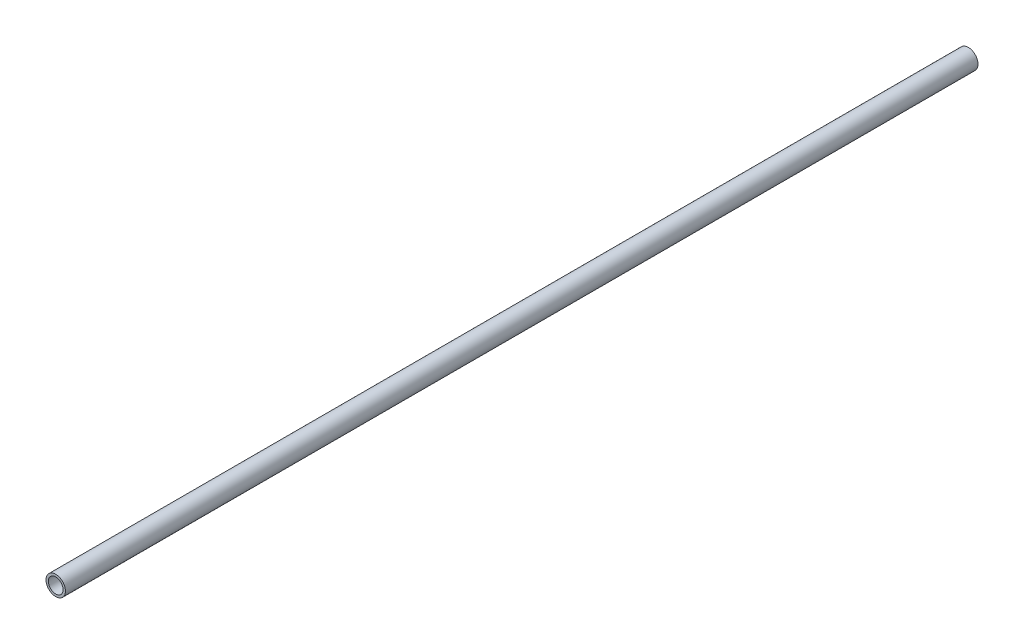
ISO-10303-21;
HEADER;
FILE_DESCRIPTION(('STEP AP214'),'2;1');
FILE_NAME('part.step','',(''),(''),'','','');
FILE_SCHEMA(('AUTOMOTIVE_DESIGN { 1 0 10303 214 1 1 1 1 }'));
ENDSEC;
DATA;
#1=APPLICATION_CONTEXT('core data for automotive mechanical design processes');
#2=APPLICATION_PROTOCOL_DEFINITION('international standard','automotive_design',2000,#1);
#3=PRODUCT_CONTEXT('',#1,'mechanical');
#4=PRODUCT('Part','Part','',(#3));
#5=PRODUCT_RELATED_PRODUCT_CATEGORY('part','',(#4));
#6=PRODUCT_DEFINITION_FORMATION('','',#4);
#7=PRODUCT_DEFINITION_CONTEXT('part definition',#1,'design');
#8=PRODUCT_DEFINITION('design','',#6,#7);
#9=PRODUCT_DEFINITION_SHAPE('','',#8);
#10=(LENGTH_UNIT() NAMED_UNIT(*) SI_UNIT(.MILLI.,.METRE.));
#11=(NAMED_UNIT(*) PLANE_ANGLE_UNIT() SI_UNIT($,.RADIAN.));
#12=(NAMED_UNIT(*) SI_UNIT($,.STERADIAN.) SOLID_ANGLE_UNIT());
#13=UNCERTAINTY_MEASURE_WITH_UNIT(LENGTH_MEASURE(1.E-05),#10,'distance_accuracy_value','');
#14=(GEOMETRIC_REPRESENTATION_CONTEXT(3) GLOBAL_UNCERTAINTY_ASSIGNED_CONTEXT((#13)) GLOBAL_UNIT_ASSIGNED_CONTEXT((#10,
#11,#12)) REPRESENTATION_CONTEXT('',''));
#15=CARTESIAN_POINT('',(0.,0.,0.));
#16=DIRECTION('',(0.,0.,1.));
#17=DIRECTION('',(1.,0.,0.));
#18=AXIS2_PLACEMENT_3D('',#15,#16,#17);
#19=CARTESIAN_POINT('',(0.,0.,1568.196));
#20=DIRECTION('',(0.,0.,1.));
#21=DIRECTION('',(1.,0.,0.));
#22=AXIS2_PLACEMENT_3D('',#19,#20,#21);
#23=PLANE('',#22);
#24=CARTESIAN_POINT('',(0.,0.,1568.196));
#25=DIRECTION('',(0.,0.,1.));
#26=DIRECTION('',(1.,0.,0.));
#27=AXIS2_PLACEMENT_3D('',#24,#25,#26);
#28=CIRCLE('',#27,16.7005);
#29=CARTESIAN_POINT('',(-16.7005,0.,1568.196));
#30=VERTEX_POINT('',#29);
#31=EDGE_CURVE('E10',#30,#30,#28,.T.);
#32=ORIENTED_EDGE('',*,*,#31,.T.);
#33=EDGE_LOOP('',(#32));
#34=FACE_BOUND('',#33,.T.);
#35=CARTESIAN_POINT('',(0.,0.,1568.196));
#36=DIRECTION('',(0.,0.,1.));
#37=DIRECTION('',(1.,0.,0.));
#38=AXIS2_PLACEMENT_3D('',#35,#36,#37);
#39=CIRCLE('',#38,12.7);
#40=CARTESIAN_POINT('',(-12.7,0.,1568.196));
#41=VERTEX_POINT('',#40);
#42=EDGE_CURVE('E44',#41,#41,#39,.T.);
#43=ORIENTED_EDGE('',*,*,#42,.F.);
#44=EDGE_LOOP('',(#43));
#45=FACE_BOUND('',#44,.T.);
#46=ADVANCED_FACE('F33',(#34,#45),#23,.T.);
#47=CARTESIAN_POINT('',(0.,0.,0.));
#48=DIRECTION('',(0.,0.,1.));
#49=DIRECTION('',(1.,0.,0.));
#50=AXIS2_PLACEMENT_3D('',#47,#48,#49);
#51=PLANE('',#50);
#52=CARTESIAN_POINT('',(0.,0.,0.));
#53=DIRECTION('',(0.,0.,1.));
#54=DIRECTION('',(1.,0.,0.));
#55=AXIS2_PLACEMENT_3D('',#52,#53,#54);
#56=CIRCLE('',#55,16.7005);
#57=CARTESIAN_POINT('',(-16.7005,0.,-2.22044604925031E-13));
#58=VERTEX_POINT('',#57);
#59=EDGE_CURVE('E37',#58,#58,#56,.T.);
#60=ORIENTED_EDGE('',*,*,#59,.F.);
#61=EDGE_LOOP('',(#60));
#62=FACE_BOUND('',#61,.T.);
#63=CARTESIAN_POINT('',(0.,0.,0.));
#64=DIRECTION('',(0.,0.,1.));
#65=DIRECTION('',(1.,0.,0.));
#66=AXIS2_PLACEMENT_3D('',#63,#64,#65);
#67=CIRCLE('',#66,12.7);
#68=CARTESIAN_POINT('',(-12.7,0.,-2.22044604925031E-13));
#69=VERTEX_POINT('',#68);
#70=EDGE_CURVE('E46',#69,#69,#67,.T.);
#71=ORIENTED_EDGE('',*,*,#70,.T.);
#72=EDGE_LOOP('',(#71));
#73=FACE_BOUND('',#72,.T.);
#74=ADVANCED_FACE('F56',(#62,#73),#51,.F.);
#75=CARTESIAN_POINT('',(0.,0.,1568.196));
#76=DIRECTION('',(0.,0.,-1.));
#77=DIRECTION('',(-1.,0.,0.));
#78=AXIS2_PLACEMENT_3D('',#75,#76,#77);
#79=CYLINDRICAL_SURFACE('',#78,16.7005);
#80=CARTESIAN_POINT('',(-16.7005,0.,1568.196));
#81=CARTESIAN_POINT('',(-16.7005,0.,1551.860625));
#82=CARTESIAN_POINT('',(-16.7005,0.,1535.52525));
#83=CARTESIAN_POINT('',(-16.7005,0.,1502.8545));
#84=CARTESIAN_POINT('',(-16.7005,0.,1486.519125));
#85=CARTESIAN_POINT('',(-16.7005,0.,1453.848375));
#86=CARTESIAN_POINT('',(-16.7005,0.,1437.513));
#87=CARTESIAN_POINT('',(-16.7005,0.,1404.84225));
#88=CARTESIAN_POINT('',(-16.7005,0.,1388.506875));
#89=CARTESIAN_POINT('',(-16.7005,0.,1355.836125));
#90=CARTESIAN_POINT('',(-16.7005,0.,1339.50075));
#91=CARTESIAN_POINT('',(-16.7005,0.,1306.83));
#92=CARTESIAN_POINT('',(-16.7005,0.,1290.494625));
#93=CARTESIAN_POINT('',(-16.7005,0.,1257.823875));
#94=CARTESIAN_POINT('',(-16.7005,0.,1241.4885));
#95=CARTESIAN_POINT('',(-16.7005,0.,1208.81775));
#96=CARTESIAN_POINT('',(-16.7005,0.,1192.482375));
#97=CARTESIAN_POINT('',(-16.7005,0.,1159.811625));
#98=CARTESIAN_POINT('',(-16.7005,0.,1143.47625));
#99=CARTESIAN_POINT('',(-16.7005,0.,1110.8055));
#100=CARTESIAN_POINT('',(-16.7005,0.,1094.470125));
#101=CARTESIAN_POINT('',(-16.7005,0.,1061.799375));
#102=CARTESIAN_POINT('',(-16.7005,0.,1045.464));
#103=CARTESIAN_POINT('',(-16.7005,0.,1012.79325));
#104=CARTESIAN_POINT('',(-16.7005,0.,996.457875));
#105=CARTESIAN_POINT('',(-16.7005,0.,963.787125));
#106=CARTESIAN_POINT('',(-16.7005,0.,947.45175));
#107=CARTESIAN_POINT('',(-16.7005,0.,914.781));
#108=CARTESIAN_POINT('',(-16.7005,0.,898.445625));
#109=CARTESIAN_POINT('',(-16.7005,0.,865.774875));
#110=CARTESIAN_POINT('',(-16.7005,0.,849.4395));
#111=CARTESIAN_POINT('',(-16.7005,0.,816.76875));
#112=CARTESIAN_POINT('',(-16.7005,0.,800.433375));
#113=CARTESIAN_POINT('',(-16.7005,0.,767.762625));
#114=CARTESIAN_POINT('',(-16.7005,0.,751.42725));
#115=CARTESIAN_POINT('',(-16.7005,0.,718.7565));
#116=CARTESIAN_POINT('',(-16.7005,0.,702.421125));
#117=CARTESIAN_POINT('',(-16.7005,0.,669.750375));
#118=CARTESIAN_POINT('',(-16.7005,0.,653.415));
#119=CARTESIAN_POINT('',(-16.7005,0.,620.74425));
#120=CARTESIAN_POINT('',(-16.7005,0.,604.408875));
#121=CARTESIAN_POINT('',(-16.7005,0.,571.738125));
#122=CARTESIAN_POINT('',(-16.7005,0.,555.40275));
#123=CARTESIAN_POINT('',(-16.7005,0.,522.732));
#124=CARTESIAN_POINT('',(-16.7005,0.,506.396625));
#125=CARTESIAN_POINT('',(-16.7005,0.,473.725875));
#126=CARTESIAN_POINT('',(-16.7005,0.,457.3905));
#127=CARTESIAN_POINT('',(-16.7005,0.,424.71975));
#128=CARTESIAN_POINT('',(-16.7005,0.,408.384375));
#129=CARTESIAN_POINT('',(-16.7005,0.,375.713625));
#130=CARTESIAN_POINT('',(-16.7005,0.,359.37825));
#131=CARTESIAN_POINT('',(-16.7005,0.,326.7075));
#132=CARTESIAN_POINT('',(-16.7005,0.,310.372125));
#133=CARTESIAN_POINT('',(-16.7005,0.,277.701375));
#134=CARTESIAN_POINT('',(-16.7005,0.,261.366));
#135=CARTESIAN_POINT('',(-16.7005,0.,228.69525));
#136=CARTESIAN_POINT('',(-16.7005,0.,212.359875));
#137=CARTESIAN_POINT('',(-16.7005,0.,179.689125));
#138=CARTESIAN_POINT('',(-16.7005,0.,163.35375));
#139=CARTESIAN_POINT('',(-16.7005,0.,130.683));
#140=CARTESIAN_POINT('',(-16.7005,0.,114.347625));
#141=CARTESIAN_POINT('',(-16.7005,0.,81.6768749999998));
#142=CARTESIAN_POINT('',(-16.7005,0.,65.3414999999998));
#143=CARTESIAN_POINT('',(-16.7005,0.,32.6707499999998));
#144=CARTESIAN_POINT('',(-16.7005,0.,16.3353749999998));
#145=CARTESIAN_POINT('',(-16.7005,0.,-2.22044604925031E-13));
#146=B_SPLINE_CURVE_WITH_KNOTS('',3,(#80,#81,#82,#83,#84,#85,#86,#87,#88,#89,#90,#91,#92,#93,
#94,#95,#96,#97,#98,#99,#100,#101,#102,#103,#104,#105,#106,#107,#108,#109,#110,#111,#112,#113,
#114,#115,#116,#117,#118,#119,#120,#121,#122,#123,#124,#125,#126,#127,#128,#129,#130,#131,#132,
#133,#134,#135,#136,#137,#138,#139,#140,#141,#142,#143,#144,#145),.UNSPECIFIED.,.F.,.F.,(4,2,2,
2,2,2,2,2,2,2,2,2,2,2,2,2,2,2,2,2,2,2,2,2,2,2,2,2,2,2,2,2,4),(0.,49.006125,98.01225,147.018375,
196.0245,245.030625,294.03675,343.042875,392.049,441.055125,490.06125,539.067375,588.0735,
637.079625,686.08575,735.091875,784.098,833.104125,882.11025,931.116375,980.1225,1029.128625,
1078.13475,1127.140875,1176.147,1225.153125,1274.15925,1323.165375,1372.1715,1421.177625,
1470.18375,1519.189875,1568.196),.UNSPECIFIED.);
#147=EDGE_CURVE('BSEAM35',#30,#58,#146,.T.);
#148=ORIENTED_EDGE('',*,*,#31,.F.);
#149=ORIENTED_EDGE('',*,*,#59,.T.);
#150=ORIENTED_EDGE('',*,*,#147,.T.);
#151=ORIENTED_EDGE('',*,*,#147,.F.);
#152=EDGE_LOOP('',(#148,#150,#149,#151));
#153=FACE_BOUND('',#152,.T.);
#154=ADVANCED_FACE('F35',(#153),#79,.T.);
#155=CARTESIAN_POINT('',(0.,0.,1568.196));
#156=DIRECTION('',(0.,0.,-1.));
#157=DIRECTION('',(-1.,0.,0.));
#158=AXIS2_PLACEMENT_3D('',#155,#156,#157);
#159=CYLINDRICAL_SURFACE('',#158,12.7);
#160=CARTESIAN_POINT('',(-12.7,0.,1568.196));
#161=CARTESIAN_POINT('',(-12.7,0.,1551.860625));
#162=CARTESIAN_POINT('',(-12.7,0.,1535.52525));
#163=CARTESIAN_POINT('',(-12.7,0.,1502.8545));
#164=CARTESIAN_POINT('',(-12.7,0.,1486.519125));
#165=CARTESIAN_POINT('',(-12.7,0.,1453.848375));
#166=CARTESIAN_POINT('',(-12.7,0.,1437.513));
#167=CARTESIAN_POINT('',(-12.7,0.,1404.84225));
#168=CARTESIAN_POINT('',(-12.7,0.,1388.506875));
#169=CARTESIAN_POINT('',(-12.7,0.,1355.836125));
#170=CARTESIAN_POINT('',(-12.7,0.,1339.50075));
#171=CARTESIAN_POINT('',(-12.7,0.,1306.83));
#172=CARTESIAN_POINT('',(-12.7,0.,1290.494625));
#173=CARTESIAN_POINT('',(-12.7,0.,1257.823875));
#174=CARTESIAN_POINT('',(-12.7,0.,1241.4885));
#175=CARTESIAN_POINT('',(-12.7,0.,1208.81775));
#176=CARTESIAN_POINT('',(-12.7,0.,1192.482375));
#177=CARTESIAN_POINT('',(-12.7,0.,1159.811625));
#178=CARTESIAN_POINT('',(-12.7,0.,1143.47625));
#179=CARTESIAN_POINT('',(-12.7,0.,1110.8055));
#180=CARTESIAN_POINT('',(-12.7,0.,1094.470125));
#181=CARTESIAN_POINT('',(-12.7,0.,1061.799375));
#182=CARTESIAN_POINT('',(-12.7,0.,1045.464));
#183=CARTESIAN_POINT('',(-12.7,0.,1012.79325));
#184=CARTESIAN_POINT('',(-12.7,0.,996.457875));
#185=CARTESIAN_POINT('',(-12.7,0.,963.787125));
#186=CARTESIAN_POINT('',(-12.7,0.,947.45175));
#187=CARTESIAN_POINT('',(-12.7,0.,914.781));
#188=CARTESIAN_POINT('',(-12.7,0.,898.445625));
#189=CARTESIAN_POINT('',(-12.7,0.,865.774875));
#190=CARTESIAN_POINT('',(-12.7,0.,849.4395));
#191=CARTESIAN_POINT('',(-12.7,0.,816.76875));
#192=CARTESIAN_POINT('',(-12.7,0.,800.433375));
#193=CARTESIAN_POINT('',(-12.7,0.,767.762625));
#194=CARTESIAN_POINT('',(-12.7,0.,751.42725));
#195=CARTESIAN_POINT('',(-12.7,0.,718.7565));
#196=CARTESIAN_POINT('',(-12.7,0.,702.421125));
#197=CARTESIAN_POINT('',(-12.7,0.,669.750375));
#198=CARTESIAN_POINT('',(-12.7,0.,653.415));
#199=CARTESIAN_POINT('',(-12.7,0.,620.74425));
#200=CARTESIAN_POINT('',(-12.7,0.,604.408875));
#201=CARTESIAN_POINT('',(-12.7,0.,571.738125));
#202=CARTESIAN_POINT('',(-12.7,0.,555.40275));
#203=CARTESIAN_POINT('',(-12.7,0.,522.732));
#204=CARTESIAN_POINT('',(-12.7,0.,506.396625));
#205=CARTESIAN_POINT('',(-12.7,0.,473.725875));
#206=CARTESIAN_POINT('',(-12.7,0.,457.3905));
#207=CARTESIAN_POINT('',(-12.7,0.,424.71975));
#208=CARTESIAN_POINT('',(-12.7,0.,408.384375));
#209=CARTESIAN_POINT('',(-12.7,0.,375.713625));
#210=CARTESIAN_POINT('',(-12.7,0.,359.37825));
#211=CARTESIAN_POINT('',(-12.7,0.,326.7075));
#212=CARTESIAN_POINT('',(-12.7,0.,310.372125));
#213=CARTESIAN_POINT('',(-12.7,0.,277.701375));
#214=CARTESIAN_POINT('',(-12.7,0.,261.366));
#215=CARTESIAN_POINT('',(-12.7,0.,228.69525));
#216=CARTESIAN_POINT('',(-12.7,0.,212.359875));
#217=CARTESIAN_POINT('',(-12.7,0.,179.689125));
#218=CARTESIAN_POINT('',(-12.7,0.,163.35375));
#219=CARTESIAN_POINT('',(-12.7,0.,130.683));
#220=CARTESIAN_POINT('',(-12.7,0.,114.347625));
#221=CARTESIAN_POINT('',(-12.7,0.,81.6768749999998));
#222=CARTESIAN_POINT('',(-12.7,0.,65.3414999999998));
#223=CARTESIAN_POINT('',(-12.7,0.,32.6707499999998));
#224=CARTESIAN_POINT('',(-12.7,0.,16.3353749999998));
#225=CARTESIAN_POINT('',(-12.7,0.,-2.22044604925031E-13));
#226=B_SPLINE_CURVE_WITH_KNOTS('',3,(#160,#161,#162,#163,#164,#165,#166,#167,#168,#169,#170,
#171,#172,#173,#174,#175,#176,#177,#178,#179,#180,#181,#182,#183,#184,#185,#186,#187,#188,#189,
#190,#191,#192,#193,#194,#195,#196,#197,#198,#199,#200,#201,#202,#203,#204,#205,#206,#207,#208,
#209,#210,#211,#212,#213,#214,#215,#216,#217,#218,#219,#220,#221,#222,#223,#224,#225),
.UNSPECIFIED.,.F.,.F.,(4,2,2,2,2,2,2,2,2,2,2,2,2,2,2,2,2,2,2,2,2,2,2,2,2,2,2,2,2,2,2,2,4),(0.,
49.0061249999998,98.0122499999998,147.018375,196.0245,245.030625,294.03675,343.042875,392.049,
441.055125,490.06125,539.067375,588.0735,637.079625,686.08575,735.091875,784.098,833.104125,
882.11025,931.116375,980.1225,1029.128625,1078.13475,1127.140875,1176.147,1225.153125,
1274.15925,1323.165375,1372.1715,1421.177625,1470.18375,1519.189875,1568.196),.UNSPECIFIED.);
#227=EDGE_CURVE('BSEAM52',#41,#69,#226,.T.);
#228=ORIENTED_EDGE('',*,*,#42,.T.);
#229=ORIENTED_EDGE('',*,*,#70,.F.);
#230=ORIENTED_EDGE('',*,*,#227,.T.);
#231=ORIENTED_EDGE('',*,*,#227,.F.);
#232=EDGE_LOOP('',(#228,#230,#229,#231));
#233=FACE_BOUND('',#232,.T.);
#234=ADVANCED_FACE('F52',(#233),#159,.F.);
#235=CLOSED_SHELL('',(#46,#74,#154,#234));
#236=MANIFOLD_SOLID_BREP('B2',#235);
#237=ADVANCED_BREP_SHAPE_REPRESENTATION('',(#18,#236),#14);
#238=SHAPE_DEFINITION_REPRESENTATION(#9,#237);
ENDSEC;
END-ISO-10303-21;
